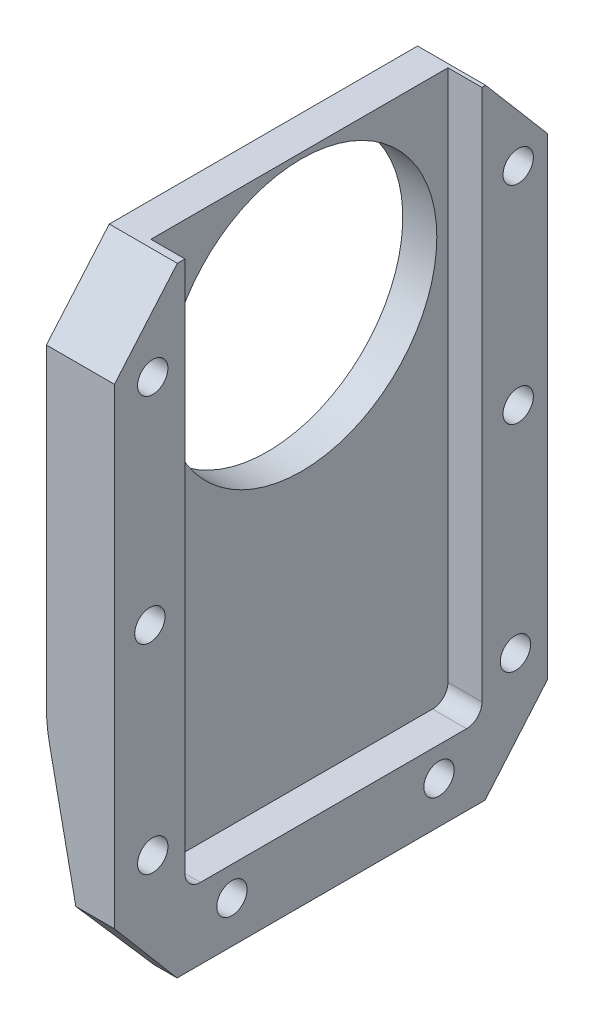
ISO-10303-21;
HEADER;
FILE_DESCRIPTION(('STEP AP214'),'2;1');
FILE_NAME('part.step','',(''),(''),'','','');
FILE_SCHEMA(('AUTOMOTIVE_DESIGN { 1 0 10303 214 1 1 1 1 }'));
ENDSEC;
DATA;
#1=APPLICATION_CONTEXT('core data for automotive mechanical design processes');
#2=APPLICATION_PROTOCOL_DEFINITION('international standard','automotive_design',2000,#1);
#3=PRODUCT_CONTEXT('',#1,'mechanical');
#4=PRODUCT('Part','Part','',(#3));
#5=PRODUCT_RELATED_PRODUCT_CATEGORY('part','',(#4));
#6=PRODUCT_DEFINITION_FORMATION('','',#4);
#7=PRODUCT_DEFINITION_CONTEXT('part definition',#1,'design');
#8=PRODUCT_DEFINITION('design','',#6,#7);
#9=PRODUCT_DEFINITION_SHAPE('','',#8);
#10=(LENGTH_UNIT() NAMED_UNIT(*) SI_UNIT(.MILLI.,.METRE.));
#11=(NAMED_UNIT(*) PLANE_ANGLE_UNIT() SI_UNIT($,.RADIAN.));
#12=(NAMED_UNIT(*) SI_UNIT($,.STERADIAN.) SOLID_ANGLE_UNIT());
#13=UNCERTAINTY_MEASURE_WITH_UNIT(LENGTH_MEASURE(1.E-05),#10,'distance_accuracy_value','');
#14=(GEOMETRIC_REPRESENTATION_CONTEXT(3) GLOBAL_UNCERTAINTY_ASSIGNED_CONTEXT((#13)) GLOBAL_UNIT_ASSIGNED_CONTEXT((#10,
#11,#12)) REPRESENTATION_CONTEXT('',''));
#15=CARTESIAN_POINT('',(0.,0.,0.));
#16=DIRECTION('',(0.,0.,1.));
#17=DIRECTION('',(1.,0.,0.));
#18=AXIS2_PLACEMENT_3D('',#15,#16,#17);
#19=CARTESIAN_POINT('',(-5.588,39.2294571648226,17.41551988832));
#20=DIRECTION('',(-1.,0.,0.));
#21=DIRECTION('',(0.,0.,1.));
#22=AXIS2_PLACEMENT_3D('',#19,#20,#21);
#23=CYLINDRICAL_SURFACE('',#22,11.1125);
#24=CARTESIAN_POINT('',(-5.588,39.2294571648226,17.41551988832));
#25=DIRECTION('',(-1.,0.,0.));
#26=DIRECTION('',(0.,0.,1.));
#27=AXIS2_PLACEMENT_3D('',#24,#25,#26);
#28=CIRCLE('',#27,11.1125);
#29=CARTESIAN_POINT('',(-5.588,39.2294571648226,28.52801988832));
#30=VERTEX_POINT('',#29);
#31=EDGE_CURVE('E177',#30,#30,#28,.T.);
#32=ORIENTED_EDGE('',*,*,#31,.T.);
#33=EDGE_LOOP('',(#32));
#34=FACE_BOUND('',#33,.T.);
#35=CARTESIAN_POINT('',(-2.794,39.2294571648226,17.41551988832));
#36=DIRECTION('',(1.,0.,0.));
#37=DIRECTION('',(0.,0.,-1.));
#38=AXIS2_PLACEMENT_3D('',#35,#36,#37);
#39=CIRCLE('',#38,11.1125);
#40=CARTESIAN_POINT('',(-2.794,39.2294571648226,6.30301988832003));
#41=VERTEX_POINT('',#40);
#42=EDGE_CURVE('E201',#41,#41,#39,.F.);
#43=ORIENTED_EDGE('',*,*,#42,.F.);
#44=EDGE_LOOP('',(#43));
#45=FACE_BOUND('',#44,.T.);
#46=ADVANCED_FACE('F37',(#34,#45),#23,.F.);
#47=CARTESIAN_POINT('',(-1.91664376205864,0.,35.56));
#48=DIRECTION('',(0.,1.,0.));
#49=DIRECTION('',(0.,0.,1.));
#50=AXIS2_PLACEMENT_3D('',#47,#48,#49);
#51=PLANE('',#50);
#52=DIRECTION('',(0.,0.,-1.));
#53=VECTOR('',#52,1.);
#54=CARTESIAN_POINT('',(-1.91664376205864,0.,35.56));
#55=LINE('',#54,#53);
#56=CARTESIAN_POINT('',(-1.91664376205864,0.,30.4170918583045));
#57=VERTEX_POINT('',#56);
#58=CARTESIAN_POINT('',(-1.91664376205864,0.,5.12869281639009));
#59=VERTEX_POINT('',#58);
#60=EDGE_CURVE('E181',#57,#59,#55,.T.);
#61=ORIENTED_EDGE('',*,*,#60,.T.);
#62=DIRECTION('',(1.,0.,0.));
#63=VECTOR('',#62,1.);
#64=CARTESIAN_POINT('',(-5.588,0.,5.12869281639009));
#65=LINE('',#64,#63);
#66=CARTESIAN_POINT('',(0.,0.,5.12869281639009));
#67=VERTEX_POINT('',#66);
#68=EDGE_CURVE('E343',#59,#67,#65,.T.);
#69=ORIENTED_EDGE('',*,*,#68,.T.);
#70=DIRECTION('',(0.,0.,-1.));
#71=VECTOR('',#70,1.);
#72=CARTESIAN_POINT('',(0.,0.,35.56));
#73=LINE('',#72,#71);
#74=CARTESIAN_POINT('',(0.,0.,30.4170918583045));
#75=VERTEX_POINT('',#74);
#76=EDGE_CURVE('E189',#75,#67,#73,.T.);
#77=ORIENTED_EDGE('',*,*,#76,.F.);
#78=DIRECTION('',(1.,0.,0.));
#79=VECTOR('',#78,1.);
#80=CARTESIAN_POINT('',(-5.588,0.,30.4170918583045));
#81=LINE('',#80,#79);
#82=EDGE_CURVE('E344',#57,#75,#81,.T.);
#83=ORIENTED_EDGE('',*,*,#82,.F.);
#84=EDGE_LOOP('',(#61,#69,#77,#83));
#85=FACE_BOUND('',#84,.T.);
#86=ADVANCED_FACE('F392',(#85),#51,.F.);
#87=CARTESIAN_POINT('',(0.,0.,35.56));
#88=DIRECTION('',(-1.,0.,0.));
#89=DIRECTION('',(0.,0.,1.));
#90=AXIS2_PLACEMENT_3D('',#87,#88,#89);
#91=PLANE('',#90);
#92=CARTESIAN_POINT('',(0.,43.7294571648226,32.41551988832));
#93=DIRECTION('',(-1.,0.,0.));
#94=DIRECTION('',(0.,0.,1.));
#95=AXIS2_PLACEMENT_3D('',#92,#93,#94);
#96=CIRCLE('',#95,1.24459999999998);
#97=CARTESIAN_POINT('',(0.,43.7294571648226,33.66011988832));
#98=VERTEX_POINT('',#97);
#99=EDGE_CURVE('E321',#98,#98,#96,.T.);
#100=ORIENTED_EDGE('',*,*,#99,.T.);
#101=EDGE_LOOP('',(#100));
#102=FACE_BOUND('',#101,.T.);
#103=CARTESIAN_POINT('',(0.,26.2121209568681,32.6523133638927));
#104=DIRECTION('',(-1.,0.,0.));
#105=DIRECTION('',(0.,0.,1.));
#106=AXIS2_PLACEMENT_3D('',#103,#104,#105);
#107=CIRCLE('',#106,1.24459999999999);
#108=CARTESIAN_POINT('',(0.,26.2121209568681,33.8969133638927));
#109=VERTEX_POINT('',#108);
#110=EDGE_CURVE('E312',#109,#109,#107,.T.);
#111=ORIENTED_EDGE('',*,*,#110,.T.);
#112=EDGE_LOOP('',(#111));
#113=FACE_BOUND('',#112,.T.);
#114=CARTESIAN_POINT('',(0.,9.72945716482264,32.41551988832));
#115=DIRECTION('',(-1.,0.,0.));
#116=DIRECTION('',(0.,0.,1.));
#117=AXIS2_PLACEMENT_3D('',#114,#115,#116);
#118=CIRCLE('',#117,1.24459999999999);
#119=CARTESIAN_POINT('',(0.,9.72945716482264,33.66011988832));
#120=VERTEX_POINT('',#119);
#121=EDGE_CURVE('E309',#120,#120,#118,.T.);
#122=ORIENTED_EDGE('',*,*,#121,.T.);
#123=EDGE_LOOP('',(#122));
#124=FACE_BOUND('',#123,.T.);
#125=CARTESIAN_POINT('',(0.,3.42945716482264,25.91551988832));
#126=DIRECTION('',(-1.,0.,0.));
#127=DIRECTION('',(0.,0.,1.));
#128=AXIS2_PLACEMENT_3D('',#125,#126,#127);
#129=CIRCLE('',#128,1.24459999999999);
#130=CARTESIAN_POINT('',(0.,3.42945716482264,27.16011988832));
#131=VERTEX_POINT('',#130);
#132=EDGE_CURVE('E303',#131,#131,#129,.T.);
#133=ORIENTED_EDGE('',*,*,#132,.T.);
#134=EDGE_LOOP('',(#133));
#135=FACE_BOUND('',#134,.T.);
#136=CARTESIAN_POINT('',(0.,3.42945716482264,8.91551988832002));
#137=DIRECTION('',(-1.,0.,0.));
#138=DIRECTION('',(0.,0.,1.));
#139=AXIS2_PLACEMENT_3D('',#136,#137,#138);
#140=CIRCLE('',#139,1.24459999999999);
#141=CARTESIAN_POINT('',(0.,3.42945716482264,10.16011988832));
#142=VERTEX_POINT('',#141);
#143=EDGE_CURVE('E297',#142,#142,#140,.T.);
#144=ORIENTED_EDGE('',*,*,#143,.T.);
#145=EDGE_LOOP('',(#144));
#146=FACE_BOUND('',#145,.T.);
#147=CARTESIAN_POINT('',(0.,9.21568873612573,2.64278820790982));
#148=DIRECTION('',(-1.,0.,0.));
#149=DIRECTION('',(0.,0.,1.));
#150=AXIS2_PLACEMENT_3D('',#147,#148,#149);
#151=CIRCLE('',#150,1.24459999999999);
#152=CARTESIAN_POINT('',(0.,9.21568873612573,3.8873882079098));
#153=VERTEX_POINT('',#152);
#154=EDGE_CURVE('E291',#153,#153,#151,.T.);
#155=ORIENTED_EDGE('',*,*,#154,.T.);
#156=EDGE_LOOP('',(#155));
#157=FACE_BOUND('',#156,.T.);
#158=CARTESIAN_POINT('',(0.,26.7294571648226,2.41551988832002));
#159=DIRECTION('',(-1.,0.,0.));
#160=DIRECTION('',(0.,0.,1.));
#161=AXIS2_PLACEMENT_3D('',#158,#159,#160);
#162=CIRCLE('',#161,1.24459999999999);
#163=CARTESIAN_POINT('',(0.,26.7294571648226,3.66011988832001));
#164=VERTEX_POINT('',#163);
#165=EDGE_CURVE('E279',#164,#164,#162,.T.);
#166=ORIENTED_EDGE('',*,*,#165,.T.);
#167=EDGE_LOOP('',(#166));
#168=FACE_BOUND('',#167,.T.);
#169=CARTESIAN_POINT('',(0.,43.7294571648226,2.41551988832002));
#170=DIRECTION('',(-1.,0.,0.));
#171=DIRECTION('',(0.,0.,1.));
#172=AXIS2_PLACEMENT_3D('',#169,#170,#171);
#173=CIRCLE('',#172,1.24459999999998);
#174=CARTESIAN_POINT('',(0.,43.7294571648226,3.66011988832001));
#175=VERTEX_POINT('',#174);
#176=EDGE_CURVE('E261',#175,#175,#173,.T.);
#177=ORIENTED_EDGE('',*,*,#176,.T.);
#178=EDGE_LOOP('',(#177));
#179=FACE_BOUND('',#178,.T.);
#180=DIRECTION('',(0.,1.,0.));
#181=VECTOR('',#180,1.);
#182=CARTESIAN_POINT('',(0.,0.,0.));
#183=LINE('',#182,#181);
#184=CARTESIAN_POINT('',(0.,6.02953117205409,0.));
#185=VERTEX_POINT('',#184);
#186=CARTESIAN_POINT('',(0.,44.8248953626975,0.));
#187=VERTEX_POINT('',#186);
#188=EDGE_CURVE('E172',#185,#187,#183,.T.);
#189=ORIENTED_EDGE('',*,*,#188,.T.);
#190=DIRECTION('',(0.,-0.761517392748183,-0.648144475053216));
#191=VECTOR('',#190,1.);
#192=CARTESIAN_POINT('',(0.,44.8248953626975,0.));
#193=LINE('',#192,#191);
#194=CARTESIAN_POINT('',(0.,50.8,5.08554511743511));
#195=VERTEX_POINT('',#194);
#196=EDGE_CURVE('E59',#195,#187,#193,.T.);
#197=ORIENTED_EDGE('',*,*,#196,.F.);
#198=DIRECTION('',(0.,0.,-1.));
#199=VECTOR('',#198,1.);
#200=CARTESIAN_POINT('',(0.,50.8,35.56));
#201=LINE('',#200,#199);
#202=CARTESIAN_POINT('',(0.,50.8,5.38804272725211));
#203=VERTEX_POINT('',#202);
#204=EDGE_CURVE('E186',#203,#195,#201,.T.);
#205=ORIENTED_EDGE('',*,*,#204,.F.);
#206=DIRECTION('',(0.,1.,0.));
#207=VECTOR('',#206,1.);
#208=CARTESIAN_POINT('',(0.,50.8,5.38804272725211));
#209=LINE('',#208,#207);
#210=CARTESIAN_POINT('',(0.,7.11199999999999,5.3880427272521));
#211=VERTEX_POINT('',#210);
#212=EDGE_CURVE('E252',#211,#203,#209,.T.);
#213=ORIENTED_EDGE('',*,*,#212,.F.);
#214=CARTESIAN_POINT('',(0.,7.11199999999999,6.6580427272521));
#215=DIRECTION('',(-1.,0.,0.));
#216=DIRECTION('',(0.,0.,1.));
#217=AXIS2_PLACEMENT_3D('',#214,#215,#216);
#218=CIRCLE('',#217,1.27);
#219=CARTESIAN_POINT('',(0.,5.84199999999999,6.6580427272521));
#220=VERTEX_POINT('',#219);
#221=EDGE_CURVE('E220',#211,#220,#218,.T.);
#222=ORIENTED_EDGE('',*,*,#221,.T.);
#223=DIRECTION('',(0.,0.,-1.));
#224=VECTOR('',#223,1.);
#225=CARTESIAN_POINT('',(0.,5.84199999999999,29.7720427272521));
#226=LINE('',#225,#224);
#227=CARTESIAN_POINT('',(0.,5.84199999999999,28.5020427272521));
#228=VERTEX_POINT('',#227);
#229=EDGE_CURVE('E255',#228,#220,#226,.T.);
#230=ORIENTED_EDGE('',*,*,#229,.F.);
#231=CARTESIAN_POINT('',(0.,7.11199999999999,28.5020427272521));
#232=DIRECTION('',(-1.,0.,0.));
#233=DIRECTION('',(0.,0.,1.));
#234=AXIS2_PLACEMENT_3D('',#231,#232,#233);
#235=CIRCLE('',#234,1.27);
#236=CARTESIAN_POINT('',(0.,7.11199999999999,29.7720427272521));
#237=VERTEX_POINT('',#236);
#238=EDGE_CURVE('E218',#228,#237,#235,.T.);
#239=ORIENTED_EDGE('',*,*,#238,.T.);
#240=DIRECTION('',(0.,-1.,0.));
#241=VECTOR('',#240,1.);
#242=CARTESIAN_POINT('',(0.,50.8,29.7720427272521));
#243=LINE('',#242,#241);
#244=CARTESIAN_POINT('',(0.,50.8,29.7720427272521));
#245=VERTEX_POINT('',#244);
#246=EDGE_CURVE('E258',#245,#237,#243,.T.);
#247=ORIENTED_EDGE('',*,*,#246,.F.);
#248=CARTESIAN_POINT('',(0.,50.8,30.3975808510955));
#249=VERTEX_POINT('',#248);
#250=EDGE_CURVE('E187',#249,#245,#201,.T.);
#251=ORIENTED_EDGE('',*,*,#250,.F.);
#252=DIRECTION('',(0.,0.759083371781677,-0.650993421383473));
#253=VECTOR('',#252,1.);
#254=CARTESIAN_POINT('',(0.,44.780420684171,35.56));
#255=LINE('',#254,#253);
#256=CARTESIAN_POINT('',(0.,44.780420684171,35.56));
#257=VERTEX_POINT('',#256);
#258=EDGE_CURVE('E336',#257,#249,#255,.T.);
#259=ORIENTED_EDGE('',*,*,#258,.F.);
#260=DIRECTION('',(0.,1.,0.));
#261=VECTOR('',#260,1.);
#262=CARTESIAN_POINT('',(0.,0.,35.56));
#263=LINE('',#262,#261);
#264=CARTESIAN_POINT('',(0.,6.07121687996455,35.56));
#265=VERTEX_POINT('',#264);
#266=EDGE_CURVE('E175',#265,#257,#263,.T.);
#267=ORIENTED_EDGE('',*,*,#266,.F.);
#268=DIRECTION('',(0.,0.763031396083279,0.646361422573472));
#269=VECTOR('',#268,1.);
#270=CARTESIAN_POINT('',(0.,0.,30.4170918583045));
#271=LINE('',#270,#269);
#272=EDGE_CURVE('E51',#75,#265,#271,.T.);
#273=ORIENTED_EDGE('',*,*,#272,.F.);
#274=ORIENTED_EDGE('',*,*,#76,.T.);
#275=DIRECTION('',(0.,-0.761715388262673,0.647911774305611));
#276=VECTOR('',#275,1.);
#277=CARTESIAN_POINT('',(0.,6.02953117205409,0.));
#278=LINE('',#277,#276);
#279=EDGE_CURVE('E346',#185,#67,#278,.T.);
#280=ORIENTED_EDGE('',*,*,#279,.F.);
#281=EDGE_LOOP('',(#189,#197,#205,#213,#222,#230,#239,#247,#251,#259,#267,#273,#274,#280));
#282=FACE_BOUND('',#281,.T.);
#283=ADVANCED_FACE('F355',(#102,#113,#124,#135,#146,#157,#168,#179,#282),#91,.F.);
#284=CARTESIAN_POINT('',(0.,50.8,35.56));
#285=DIRECTION('',(0.,-1.,0.));
#286=DIRECTION('',(0.,0.,-1.));
#287=AXIS2_PLACEMENT_3D('',#284,#285,#286);
#288=PLANE('',#287);
#289=ORIENTED_EDGE('',*,*,#204,.T.);
#290=DIRECTION('',(1.,0.,0.));
#291=VECTOR('',#290,1.);
#292=CARTESIAN_POINT('',(-5.588,50.8,5.08554511743511));
#293=LINE('',#292,#291);
#294=CARTESIAN_POINT('',(-5.588,50.8,5.08554511743511));
#295=VERTEX_POINT('',#294);
#296=EDGE_CURVE('E155',#295,#195,#293,.T.);
#297=ORIENTED_EDGE('',*,*,#296,.F.);
#298=DIRECTION('',(0.,0.,-1.));
#299=VECTOR('',#298,1.);
#300=CARTESIAN_POINT('',(-5.588,50.8,35.56));
#301=LINE('',#300,#299);
#302=CARTESIAN_POINT('',(-5.588,50.8,30.3975808510955));
#303=VERTEX_POINT('',#302);
#304=EDGE_CURVE('E165',#303,#295,#301,.T.);
#305=ORIENTED_EDGE('',*,*,#304,.F.);
#306=DIRECTION('',(1.,0.,0.));
#307=VECTOR('',#306,1.);
#308=CARTESIAN_POINT('',(-5.588,50.8,30.3975808510955));
#309=LINE('',#308,#307);
#310=EDGE_CURVE('E330',#303,#249,#309,.T.);
#311=ORIENTED_EDGE('',*,*,#310,.T.);
#312=ORIENTED_EDGE('',*,*,#250,.T.);
#313=DIRECTION('',(1.,0.,0.));
#314=VECTOR('',#313,1.);
#315=CARTESIAN_POINT('',(-2.794,50.8,29.7720427272521));
#316=LINE('',#315,#314);
#317=CARTESIAN_POINT('',(-2.794,50.8,29.7720427272521));
#318=VERTEX_POINT('',#317);
#319=EDGE_CURVE('E204',#318,#245,#316,.T.);
#320=ORIENTED_EDGE('',*,*,#319,.F.);
#321=DIRECTION('',(0.,0.,1.));
#322=VECTOR('',#321,1.);
#323=CARTESIAN_POINT('',(-2.794,50.8,29.7720427272521));
#324=LINE('',#323,#322);
#325=CARTESIAN_POINT('',(-2.794,50.8,5.3880427272521));
#326=VERTEX_POINT('',#325);
#327=EDGE_CURVE('E249',#326,#318,#324,.T.);
#328=ORIENTED_EDGE('',*,*,#327,.F.);
#329=DIRECTION('',(1.,0.,0.));
#330=VECTOR('',#329,1.);
#331=CARTESIAN_POINT('',(-2.794,50.8,5.38804272725211));
#332=LINE('',#331,#330);
#333=EDGE_CURVE('E246',#326,#203,#332,.T.);
#334=ORIENTED_EDGE('',*,*,#333,.T.);
#335=EDGE_LOOP('',(#289,#297,#305,#311,#312,#320,#328,#334));
#336=FACE_BOUND('',#335,.T.);
#337=ADVANCED_FACE('F357',(#336),#288,.F.);
#338=CARTESIAN_POINT('',(-5.588,50.8,35.56));
#339=DIRECTION('',(1.,0.,0.));
#340=DIRECTION('',(0.,0.,-1.));
#341=AXIS2_PLACEMENT_3D('',#338,#339,#340);
#342=PLANE('',#341);
#343=CARTESIAN_POINT('',(-5.588,43.7294571648226,32.41551988832));
#344=DIRECTION('',(-1.,0.,0.));
#345=DIRECTION('',(0.,0.,1.));
#346=AXIS2_PLACEMENT_3D('',#343,#344,#345);
#347=CIRCLE('',#346,1.8796);
#348=CARTESIAN_POINT('',(-5.588,43.7294571648226,34.29511988832));
#349=VERTEX_POINT('',#348);
#350=EDGE_CURVE('E327',#349,#349,#347,.T.);
#351=ORIENTED_EDGE('',*,*,#350,.F.);
#352=EDGE_LOOP('',(#351));
#353=FACE_BOUND('',#352,.T.);
#354=CARTESIAN_POINT('',(-5.588,26.2121209568681,32.6523133638927));
#355=DIRECTION('',(-1.,0.,0.));
#356=DIRECTION('',(0.,0.,1.));
#357=AXIS2_PLACEMENT_3D('',#354,#355,#356);
#358=CIRCLE('',#357,1.8796);
#359=CARTESIAN_POINT('',(-5.588,26.2121209568681,34.5319133638927));
#360=VERTEX_POINT('',#359);
#361=EDGE_CURVE('E318',#360,#360,#358,.T.);
#362=ORIENTED_EDGE('',*,*,#361,.F.);
#363=EDGE_LOOP('',(#362));
#364=FACE_BOUND('',#363,.T.);
#365=CARTESIAN_POINT('',(-5.588,26.7294571648226,2.41551988832002));
#366=DIRECTION('',(-1.,0.,0.));
#367=DIRECTION('',(0.,0.,1.));
#368=AXIS2_PLACEMENT_3D('',#365,#366,#367);
#369=CIRCLE('',#368,1.8796);
#370=CARTESIAN_POINT('',(-5.588,26.7294571648226,4.29511988832002));
#371=VERTEX_POINT('',#370);
#372=EDGE_CURVE('E285',#371,#371,#369,.T.);
#373=ORIENTED_EDGE('',*,*,#372,.F.);
#374=EDGE_LOOP('',(#373));
#375=FACE_BOUND('',#374,.T.);
#376=CARTESIAN_POINT('',(-5.588,43.7294571648226,2.41551988832002));
#377=DIRECTION('',(-1.,0.,0.));
#378=DIRECTION('',(0.,0.,1.));
#379=AXIS2_PLACEMENT_3D('',#376,#377,#378);
#380=CIRCLE('',#379,1.8796);
#381=CARTESIAN_POINT('',(-5.588,43.7294571648226,4.29511988832003));
#382=VERTEX_POINT('',#381);
#383=EDGE_CURVE('E276',#382,#382,#380,.T.);
#384=ORIENTED_EDGE('',*,*,#383,.F.);
#385=EDGE_LOOP('',(#384));
#386=FACE_BOUND('',#385,.T.);
#387=ORIENTED_EDGE('',*,*,#31,.F.);
#388=EDGE_LOOP('',(#387));
#389=FACE_BOUND('',#388,.T.);
#390=ORIENTED_EDGE('',*,*,#304,.T.);
#391=DIRECTION('',(0.,-0.761517392748183,-0.648144475053216));
#392=VECTOR('',#391,1.);
#393=CARTESIAN_POINT('',(-5.588,44.8248953626975,0.));
#394=LINE('',#393,#392);
#395=CARTESIAN_POINT('',(-5.588,44.8248953626975,0.));
#396=VERTEX_POINT('',#395);
#397=EDGE_CURVE('E149',#295,#396,#394,.T.);
#398=ORIENTED_EDGE('',*,*,#397,.T.);
#399=DIRECTION('',(0.,-1.,0.));
#400=VECTOR('',#399,1.);
#401=CARTESIAN_POINT('',(-5.588,50.8,0.));
#402=LINE('',#401,#400);
#403=CARTESIAN_POINT('',(-5.588,19.0775124180395,0.));
#404=VERTEX_POINT('',#403);
#405=EDGE_CURVE('E161',#396,#404,#402,.T.);
#406=ORIENTED_EDGE('',*,*,#405,.T.);
#407=DIRECTION('',(0.,0.,-1.));
#408=VECTOR('',#407,1.);
#409=CARTESIAN_POINT('',(-5.588,19.0775124180395,35.56));
#410=LINE('',#409,#408);
#411=CARTESIAN_POINT('',(-5.588,19.0775124180395,35.56));
#412=VERTEX_POINT('',#411);
#413=EDGE_CURVE('E196',#404,#412,#410,.F.);
#414=ORIENTED_EDGE('',*,*,#413,.T.);
#415=DIRECTION('',(0.,-1.,0.));
#416=VECTOR('',#415,1.);
#417=CARTESIAN_POINT('',(-5.588,50.8,35.56));
#418=LINE('',#417,#416);
#419=CARTESIAN_POINT('',(-5.588,44.780420684171,35.56));
#420=VERTEX_POINT('',#419);
#421=EDGE_CURVE('E237',#420,#412,#418,.T.);
#422=ORIENTED_EDGE('',*,*,#421,.F.);
#423=DIRECTION('',(0.,0.759083371781677,-0.650993421383473));
#424=VECTOR('',#423,1.);
#425=CARTESIAN_POINT('',(-5.588,44.780420684171,35.56));
#426=LINE('',#425,#424);
#427=EDGE_CURVE('E238',#420,#303,#426,.T.);
#428=ORIENTED_EDGE('',*,*,#427,.T.);
#429=EDGE_LOOP('',(#390,#398,#406,#414,#422,#428));
#430=FACE_BOUND('',#429,.T.);
#431=ADVANCED_FACE('F159',(#353,#364,#375,#386,#389,#430),#342,.F.);
#432=CARTESIAN_POINT('',(-5.588,17.78,35.56));
#433=DIRECTION('',(0.979339732195538,0.20222188047581,0.));
#434=DIRECTION('',(-0.20222188047581,0.979339732195538,0.));
#435=AXIS2_PLACEMENT_3D('',#432,#433,#434);
#436=PLANE('',#435);
#437=CARTESIAN_POINT('',(-3.9256596930966,9.72945716482264,32.41551988832));
#438=DIRECTION('',(0.979339732195538,0.20222188047581,0.));
#439=DIRECTION('',(-0.20222188047581,0.979339732195538,0.));
#440=AXIS2_PLACEMENT_3D('',#437,#438,#439);
#441=ELLIPSE('',#440,1.27085623005387,1.24459999999999);
#442=CARTESIAN_POINT('',(-4.18265462975249,10.9740571648226,32.41551988832));
#443=VERTEX_POINT('',#442);
#444=EDGE_CURVE('E306',#443,#443,#441,.T.);
#445=ORIENTED_EDGE('',*,*,#444,.T.);
#446=EDGE_LOOP('',(#445));
#447=FACE_BOUND('',#446,.T.);
#448=CARTESIAN_POINT('',(-2.62478543555832,3.42945716482264,25.91551988832));
#449=DIRECTION('',(0.979339732195538,0.20222188047581,0.));
#450=DIRECTION('',(-0.20222188047581,0.979339732195538,0.));
#451=AXIS2_PLACEMENT_3D('',#448,#449,#450);
#452=ELLIPSE('',#451,1.27085623005388,1.24459999999999);
#453=CARTESIAN_POINT('',(-2.88178037221421,4.67405716482263,25.91551988832));
#454=VERTEX_POINT('',#453);
#455=EDGE_CURVE('E300',#454,#454,#452,.T.);
#456=ORIENTED_EDGE('',*,*,#455,.T.);
#457=EDGE_LOOP('',(#456));
#458=FACE_BOUND('',#457,.T.);
#459=CARTESIAN_POINT('',(-2.62478543555832,3.42945716482264,8.91551988832002));
#460=DIRECTION('',(0.979339732195538,0.20222188047581,0.));
#461=DIRECTION('',(-0.20222188047581,0.979339732195538,0.));
#462=AXIS2_PLACEMENT_3D('',#459,#460,#461);
#463=ELLIPSE('',#462,1.27085623005388,1.24459999999999);
#464=CARTESIAN_POINT('',(-2.88178037221421,4.67405716482263,8.91551988832002));
#465=VERTEX_POINT('',#464);
#466=EDGE_CURVE('E294',#465,#465,#463,.T.);
#467=ORIENTED_EDGE('',*,*,#466,.T.);
#468=EDGE_LOOP('',(#467));
#469=FACE_BOUND('',#468,.T.);
#470=CARTESIAN_POINT('',(-3.81957268940966,9.21568873612573,2.64278820790982));
#471=DIRECTION('',(0.979339732195538,0.20222188047581,0.));
#472=DIRECTION('',(-0.20222188047581,0.979339732195538,0.));
#473=AXIS2_PLACEMENT_3D('',#470,#471,#472);
#474=ELLIPSE('',#473,1.27085623005387,1.24459999999999);
#475=CARTESIAN_POINT('',(-4.07656762606555,10.4602887361257,2.64278820790982));
#476=VERTEX_POINT('',#475);
#477=EDGE_CURVE('E288',#476,#476,#474,.T.);
#478=ORIENTED_EDGE('',*,*,#477,.T.);
#479=EDGE_LOOP('',(#478));
#480=FACE_BOUND('',#479,.T.);
#481=DIRECTION('',(0.20222188047581,-0.979339732195537,0.));
#482=VECTOR('',#481,1.);
#483=CARTESIAN_POINT('',(-5.588,17.78,0.));
#484=LINE('',#483,#482);
#485=CARTESIAN_POINT('',(-5.32561459888333,16.5092945359968,0.));
#486=VERTEX_POINT('',#485);
#487=CARTESIAN_POINT('',(-3.16166945836813,6.02953117205409,0.));
#488=VERTEX_POINT('',#487);
#489=EDGE_CURVE('E171',#486,#488,#484,.T.);
#490=ORIENTED_EDGE('',*,*,#489,.T.);
#491=DIRECTION('',(0.155374932595926,-0.752464790260893,0.640043256146366));
#492=VECTOR('',#491,1.);
#493=CARTESIAN_POINT('',(-1.05771680292443,-4.15969476772149,8.666910973793));
#494=LINE('',#493,#492);
#495=EDGE_CURVE('E228',#488,#59,#494,.T.);
#496=ORIENTED_EDGE('',*,*,#495,.T.);
#497=ORIENTED_EDGE('',*,*,#60,.F.);
#498=DIRECTION('',(-0.155636875365988,0.753733352108303,0.638485079658008));
#499=VECTOR('',#498,1.);
#500=CARTESIAN_POINT('',(-4.60238333527081,13.0067600409402,41.4350761329861));
#501=LINE('',#500,#499);
#502=CARTESIAN_POINT('',(-3.1702770558805,6.07121687996455,35.56));
#503=VERTEX_POINT('',#502);
#504=EDGE_CURVE('E338',#57,#503,#501,.T.);
#505=ORIENTED_EDGE('',*,*,#504,.T.);
#506=DIRECTION('',(0.20222188047581,-0.979339732195537,0.));
#507=VECTOR('',#506,1.);
#508=CARTESIAN_POINT('',(-5.588,17.78,35.56));
#509=LINE('',#508,#507);
#510=CARTESIAN_POINT('',(-5.32561459888333,16.5092945359968,35.56));
#511=VERTEX_POINT('',#510);
#512=EDGE_CURVE('E184',#511,#503,#509,.T.);
#513=ORIENTED_EDGE('',*,*,#512,.F.);
#514=DIRECTION('',(0.,0.,-1.));
#515=VECTOR('',#514,1.);
#516=CARTESIAN_POINT('',(-5.32561459888333,16.5092945359968,35.56));
#517=LINE('',#516,#515);
#518=EDGE_CURVE('E192',#511,#486,#517,.T.);
#519=ORIENTED_EDGE('',*,*,#518,.T.);
#520=EDGE_LOOP('',(#490,#496,#497,#505,#513,#519));
#521=FACE_BOUND('',#520,.T.);
#522=ADVANCED_FACE('F226',(#447,#458,#469,#480,#521),#436,.F.);
#523=CARTESIAN_POINT('',(0.,0.,35.56));
#524=DIRECTION('',(0.,0.,1.));
#525=DIRECTION('',(1.,0.,0.));
#526=AXIS2_PLACEMENT_3D('',#523,#524,#525);
#527=PLANE('',#526);
#528=DIRECTION('',(-1.,0.,0.));
#529=VECTOR('',#528,1.);
#530=CARTESIAN_POINT('',(0.,6.07121687996455,35.56));
#531=LINE('',#530,#529);
#532=EDGE_CURVE('E11',#265,#503,#531,.T.);
#533=ORIENTED_EDGE('',*,*,#532,.F.);
#534=ORIENTED_EDGE('',*,*,#266,.T.);
#535=DIRECTION('',(1.,0.,0.));
#536=VECTOR('',#535,1.);
#537=CARTESIAN_POINT('',(-5.588,44.780420684171,35.56));
#538=LINE('',#537,#536);
#539=EDGE_CURVE('E331',#420,#257,#538,.T.);
#540=ORIENTED_EDGE('',*,*,#539,.F.);
#541=ORIENTED_EDGE('',*,*,#421,.T.);
#542=CARTESIAN_POINT('',(7.112,19.0775124180395,35.56));
#543=DIRECTION('',(0.,0.,1.));
#544=DIRECTION('',(1.,0.,0.));
#545=AXIS2_PLACEMENT_3D('',#542,#543,#544);
#546=CIRCLE('',#545,12.7);
#547=EDGE_CURVE('E198',#412,#511,#546,.T.);
#548=ORIENTED_EDGE('',*,*,#547,.T.);
#549=ORIENTED_EDGE('',*,*,#512,.T.);
#550=EDGE_LOOP('',(#533,#534,#540,#541,#548,#549));
#551=FACE_BOUND('',#550,.T.);
#552=ADVANCED_FACE('F388',(#551),#527,.T.);
#553=CARTESIAN_POINT('',(0.,0.,0.));
#554=DIRECTION('',(0.,0.,1.));
#555=DIRECTION('',(1.,0.,0.));
#556=AXIS2_PLACEMENT_3D('',#553,#554,#555);
#557=PLANE('',#556);
#558=ORIENTED_EDGE('',*,*,#405,.F.);
#559=DIRECTION('',(1.,0.,0.));
#560=VECTOR('',#559,1.);
#561=CARTESIAN_POINT('',(-5.588,44.8248953626975,0.));
#562=LINE('',#561,#560);
#563=EDGE_CURVE('E146',#396,#187,#562,.T.);
#564=ORIENTED_EDGE('',*,*,#563,.T.);
#565=ORIENTED_EDGE('',*,*,#188,.F.);
#566=DIRECTION('',(-1.,0.,0.));
#567=VECTOR('',#566,1.);
#568=CARTESIAN_POINT('',(0.,6.02953117205409,0.));
#569=LINE('',#568,#567);
#570=EDGE_CURVE('E45',#185,#488,#569,.T.);
#571=ORIENTED_EDGE('',*,*,#570,.T.);
#572=ORIENTED_EDGE('',*,*,#489,.F.);
#573=CARTESIAN_POINT('',(7.112,19.0775124180395,0.));
#574=DIRECTION('',(0.,0.,1.));
#575=DIRECTION('',(1.,0.,0.));
#576=AXIS2_PLACEMENT_3D('',#573,#574,#575);
#577=CIRCLE('',#576,12.7);
#578=EDGE_CURVE('E169',#486,#404,#577,.F.);
#579=ORIENTED_EDGE('',*,*,#578,.T.);
#580=EDGE_LOOP('',(#558,#564,#565,#571,#572,#579));
#581=FACE_BOUND('',#580,.T.);
#582=ADVANCED_FACE('F167',(#581),#557,.F.);
#583=CARTESIAN_POINT('',(7.112,19.0775124180395,35.56));
#584=DIRECTION('',(0.,0.,-1.));
#585=DIRECTION('',(-1.,0.,0.));
#586=AXIS2_PLACEMENT_3D('',#583,#584,#585);
#587=CYLINDRICAL_SURFACE('',#586,12.7);
#588=ORIENTED_EDGE('',*,*,#547,.F.);
#589=ORIENTED_EDGE('',*,*,#413,.F.);
#590=ORIENTED_EDGE('',*,*,#578,.F.);
#591=ORIENTED_EDGE('',*,*,#518,.F.);
#592=EDGE_LOOP('',(#588,#589,#590,#591));
#593=FACE_BOUND('',#592,.T.);
#594=ADVANCED_FACE('F235',(#593),#587,.T.);
#595=CARTESIAN_POINT('',(-2.794,0.,0.));
#596=DIRECTION('',(1.,0.,0.));
#597=DIRECTION('',(0.,0.,-1.));
#598=AXIS2_PLACEMENT_3D('',#595,#596,#597);
#599=PLANE('',#598);
#600=DIRECTION('',(0.,-1.,0.));
#601=VECTOR('',#600,1.);
#602=CARTESIAN_POINT('',(-2.794,50.8,29.7720427272521));
#603=LINE('',#602,#601);
#604=CARTESIAN_POINT('',(-2.794,7.11199999999999,29.7720427272521));
#605=VERTEX_POINT('',#604);
#606=EDGE_CURVE('E254',#318,#605,#603,.T.);
#607=ORIENTED_EDGE('',*,*,#606,.T.);
#608=CARTESIAN_POINT('',(-2.794,7.11199999999999,28.5020427272521));
#609=DIRECTION('',(1.,0.,0.));
#610=DIRECTION('',(0.,0.,-1.));
#611=AXIS2_PLACEMENT_3D('',#608,#609,#610);
#612=CIRCLE('',#611,1.27);
#613=CARTESIAN_POINT('',(-2.794,5.84199999999999,28.5020427272521));
#614=VERTEX_POINT('',#613);
#615=EDGE_CURVE('E213',#605,#614,#612,.T.);
#616=ORIENTED_EDGE('',*,*,#615,.T.);
#617=DIRECTION('',(0.,0.,-1.));
#618=VECTOR('',#617,1.);
#619=CARTESIAN_POINT('',(-2.794,5.84199999999999,29.7720427272521));
#620=LINE('',#619,#618);
#621=CARTESIAN_POINT('',(-2.794,5.84199999999999,6.6580427272521));
#622=VERTEX_POINT('',#621);
#623=EDGE_CURVE('E266',#614,#622,#620,.T.);
#624=ORIENTED_EDGE('',*,*,#623,.T.);
#625=CARTESIAN_POINT('',(-2.794,7.11199999999999,6.6580427272521));
#626=DIRECTION('',(1.,0.,0.));
#627=DIRECTION('',(0.,0.,-1.));
#628=AXIS2_PLACEMENT_3D('',#625,#626,#627);
#629=CIRCLE('',#628,1.27);
#630=CARTESIAN_POINT('',(-2.794,7.11199999999999,5.3880427272521));
#631=VERTEX_POINT('',#630);
#632=EDGE_CURVE('E211',#622,#631,#629,.T.);
#633=ORIENTED_EDGE('',*,*,#632,.T.);
#634=DIRECTION('',(0.,1.,0.));
#635=VECTOR('',#634,1.);
#636=CARTESIAN_POINT('',(-2.794,50.8,5.38804272725211));
#637=LINE('',#636,#635);
#638=EDGE_CURVE('E264',#631,#326,#637,.T.);
#639=ORIENTED_EDGE('',*,*,#638,.T.);
#640=ORIENTED_EDGE('',*,*,#327,.T.);
#641=EDGE_LOOP('',(#607,#616,#624,#633,#639,#640));
#642=FACE_BOUND('',#641,.T.);
#643=ORIENTED_EDGE('',*,*,#42,.T.);
#644=EDGE_LOOP('',(#643));
#645=FACE_BOUND('',#644,.T.);
#646=ADVANCED_FACE('F374',(#642,#645),#599,.T.);
#647=CARTESIAN_POINT('',(-2.794,50.8,29.7720427272521));
#648=DIRECTION('',(0.,0.,1.));
#649=DIRECTION('',(0.,-1.,0.));
#650=AXIS2_PLACEMENT_3D('',#647,#648,#649);
#651=PLANE('',#650);
#652=ORIENTED_EDGE('',*,*,#246,.T.);
#653=DIRECTION('',(1.,0.,0.));
#654=VECTOR('',#653,1.);
#655=CARTESIAN_POINT('',(-2.794,7.11199999999999,29.7720427272521));
#656=LINE('',#655,#654);
#657=EDGE_CURVE('E209',#237,#605,#656,.F.);
#658=ORIENTED_EDGE('',*,*,#657,.T.);
#659=ORIENTED_EDGE('',*,*,#606,.F.);
#660=ORIENTED_EDGE('',*,*,#319,.T.);
#661=EDGE_LOOP('',(#652,#658,#659,#660));
#662=FACE_BOUND('',#661,.T.);
#663=ADVANCED_FACE('F383',(#662),#651,.F.);
#664=CARTESIAN_POINT('',(-2.794,50.8,5.38804272725211));
#665=DIRECTION('',(0.,0.,-1.));
#666=DIRECTION('',(0.,1.,0.));
#667=AXIS2_PLACEMENT_3D('',#664,#665,#666);
#668=PLANE('',#667);
#669=ORIENTED_EDGE('',*,*,#638,.F.);
#670=DIRECTION('',(1.,0.,0.));
#671=VECTOR('',#670,1.);
#672=CARTESIAN_POINT('',(0.,7.11199999999999,5.3880427272521));
#673=LINE('',#672,#671);
#674=EDGE_CURVE('E215',#631,#211,#673,.T.);
#675=ORIENTED_EDGE('',*,*,#674,.T.);
#676=ORIENTED_EDGE('',*,*,#212,.T.);
#677=ORIENTED_EDGE('',*,*,#333,.F.);
#678=EDGE_LOOP('',(#669,#675,#676,#677));
#679=FACE_BOUND('',#678,.T.);
#680=ADVANCED_FACE('F363',(#679),#668,.F.);
#681=CARTESIAN_POINT('',(-2.794,5.84199999999999,29.7720427272521));
#682=DIRECTION('',(0.,-1.,0.));
#683=DIRECTION('',(0.,0.,-1.));
#684=AXIS2_PLACEMENT_3D('',#681,#682,#683);
#685=PLANE('',#684);
#686=ORIENTED_EDGE('',*,*,#623,.F.);
#687=DIRECTION('',(1.,0.,0.));
#688=VECTOR('',#687,1.);
#689=CARTESIAN_POINT('',(0.,5.84199999999999,28.5020427272521));
#690=LINE('',#689,#688);
#691=EDGE_CURVE('E206',#614,#228,#690,.T.);
#692=ORIENTED_EDGE('',*,*,#691,.T.);
#693=ORIENTED_EDGE('',*,*,#229,.T.);
#694=DIRECTION('',(1.,0.,0.));
#695=VECTOR('',#694,1.);
#696=CARTESIAN_POINT('',(-2.794,5.84199999999999,6.6580427272521));
#697=LINE('',#696,#695);
#698=EDGE_CURVE('E200',#220,#622,#697,.F.);
#699=ORIENTED_EDGE('',*,*,#698,.T.);
#700=EDGE_LOOP('',(#686,#692,#693,#699));
#701=FACE_BOUND('',#700,.T.);
#702=ADVANCED_FACE('F370',(#701),#685,.F.);
#703=CARTESIAN_POINT('',(-2.794,7.11199999999999,28.5020427272521));
#704=DIRECTION('',(-1.,0.,0.));
#705=DIRECTION('',(0.,0.,1.));
#706=AXIS2_PLACEMENT_3D('',#703,#704,#705);
#707=CYLINDRICAL_SURFACE('',#706,1.27);
#708=ORIENTED_EDGE('',*,*,#615,.F.);
#709=ORIENTED_EDGE('',*,*,#657,.F.);
#710=ORIENTED_EDGE('',*,*,#238,.F.);
#711=ORIENTED_EDGE('',*,*,#691,.F.);
#712=EDGE_LOOP('',(#708,#709,#710,#711));
#713=FACE_BOUND('',#712,.T.);
#714=ADVANCED_FACE('F378',(#713),#707,.F.);
#715=CARTESIAN_POINT('',(-2.794,7.11199999999999,6.6580427272521));
#716=DIRECTION('',(-1.,0.,0.));
#717=DIRECTION('',(0.,0.,1.));
#718=AXIS2_PLACEMENT_3D('',#715,#716,#717);
#719=CYLINDRICAL_SURFACE('',#718,1.27);
#720=ORIENTED_EDGE('',*,*,#632,.F.);
#721=ORIENTED_EDGE('',*,*,#698,.F.);
#722=ORIENTED_EDGE('',*,*,#221,.F.);
#723=ORIENTED_EDGE('',*,*,#674,.F.);
#724=EDGE_LOOP('',(#720,#721,#722,#723));
#725=FACE_BOUND('',#724,.T.);
#726=ADVANCED_FACE('F39',(#725),#719,.F.);
#727=CARTESIAN_POINT('',(-5.588,43.7294571648226,2.41551988832002));
#728=DIRECTION('',(-1.,0.,0.));
#729=DIRECTION('',(0.,0.,1.));
#730=AXIS2_PLACEMENT_3D('',#727,#728,#729);
#731=CYLINDRICAL_SURFACE('',#730,1.24459999999999);
#732=ORIENTED_EDGE('',*,*,#176,.F.);
#733=EDGE_LOOP('',(#732));
#734=FACE_BOUND('',#733,.T.);
#735=CARTESIAN_POINT('',(-4.953,43.7294571648226,2.41551988832002));
#736=DIRECTION('',(-1.,0.,0.));
#737=DIRECTION('',(0.,0.,1.));
#738=AXIS2_PLACEMENT_3D('',#735,#736,#737);
#739=CIRCLE('',#738,1.2446);
#740=CARTESIAN_POINT('',(-4.953,43.7294571648226,3.66011988832002));
#741=VERTEX_POINT('',#740);
#742=EDGE_CURVE('E273',#741,#741,#739,.T.);
#743=ORIENTED_EDGE('',*,*,#742,.T.);
#744=EDGE_LOOP('',(#743));
#745=FACE_BOUND('',#744,.T.);
#746=ADVANCED_FACE('F438',(#734,#745),#731,.F.);
#747=CARTESIAN_POINT('',(-5.588,43.7294571648226,2.41551988832002));
#748=DIRECTION('',(-1.,0.,0.));
#749=DIRECTION('',(0.,0.,1.));
#750=AXIS2_PLACEMENT_3D('',#747,#748,#749);
#751=CONICAL_SURFACE('',#750,1.8796,0.78539816339745);
#752=ORIENTED_EDGE('',*,*,#742,.F.);
#753=EDGE_LOOP('',(#752));
#754=FACE_BOUND('',#753,.T.);
#755=ORIENTED_EDGE('',*,*,#383,.T.);
#756=EDGE_LOOP('',(#755));
#757=FACE_BOUND('',#756,.T.);
#758=ADVANCED_FACE('F447',(#754,#757),#751,.F.);
#759=CARTESIAN_POINT('',(-5.588,26.7294571648226,2.41551988832002));
#760=DIRECTION('',(-1.,0.,0.));
#761=DIRECTION('',(0.,0.,1.));
#762=AXIS2_PLACEMENT_3D('',#759,#760,#761);
#763=CYLINDRICAL_SURFACE('',#762,1.24459999999999);
#764=ORIENTED_EDGE('',*,*,#165,.F.);
#765=EDGE_LOOP('',(#764));
#766=FACE_BOUND('',#765,.T.);
#767=CARTESIAN_POINT('',(-4.953,26.7294571648226,2.41551988832002));
#768=DIRECTION('',(-1.,0.,0.));
#769=DIRECTION('',(0.,0.,1.));
#770=AXIS2_PLACEMENT_3D('',#767,#768,#769);
#771=CIRCLE('',#770,1.2446);
#772=CARTESIAN_POINT('',(-4.953,26.7294571648226,3.66011988832002));
#773=VERTEX_POINT('',#772);
#774=EDGE_CURVE('E282',#773,#773,#771,.T.);
#775=ORIENTED_EDGE('',*,*,#774,.T.);
#776=EDGE_LOOP('',(#775));
#777=FACE_BOUND('',#776,.T.);
#778=ADVANCED_FACE('F451',(#766,#777),#763,.F.);
#779=CARTESIAN_POINT('',(-5.588,26.7294571648226,2.41551988832002));
#780=DIRECTION('',(-1.,0.,0.));
#781=DIRECTION('',(0.,0.,1.));
#782=AXIS2_PLACEMENT_3D('',#779,#780,#781);
#783=CONICAL_SURFACE('',#782,1.8796,0.785398163397447);
#784=ORIENTED_EDGE('',*,*,#774,.F.);
#785=EDGE_LOOP('',(#784));
#786=FACE_BOUND('',#785,.T.);
#787=ORIENTED_EDGE('',*,*,#372,.T.);
#788=EDGE_LOOP('',(#787));
#789=FACE_BOUND('',#788,.T.);
#790=ADVANCED_FACE('F455',(#786,#789),#783,.F.);
#791=CARTESIAN_POINT('',(-5.588,9.21568873612573,2.64278820790982));
#792=DIRECTION('',(-1.,0.,0.));
#793=DIRECTION('',(0.,0.,1.));
#794=AXIS2_PLACEMENT_3D('',#791,#792,#793);
#795=CYLINDRICAL_SURFACE('',#794,1.24459999999999);
#796=ORIENTED_EDGE('',*,*,#154,.F.);
#797=EDGE_LOOP('',(#796));
#798=FACE_BOUND('',#797,.T.);
#799=ORIENTED_EDGE('',*,*,#477,.F.);
#800=EDGE_LOOP('',(#799));
#801=FACE_BOUND('',#800,.T.);
#802=ADVANCED_FACE('F459',(#798,#801),#795,.F.);
#803=CARTESIAN_POINT('',(-5.588,3.42945716482264,8.91551988832002));
#804=DIRECTION('',(-1.,0.,0.));
#805=DIRECTION('',(0.,0.,1.));
#806=AXIS2_PLACEMENT_3D('',#803,#804,#805);
#807=CYLINDRICAL_SURFACE('',#806,1.24459999999999);
#808=ORIENTED_EDGE('',*,*,#143,.F.);
#809=EDGE_LOOP('',(#808));
#810=FACE_BOUND('',#809,.T.);
#811=ORIENTED_EDGE('',*,*,#466,.F.);
#812=EDGE_LOOP('',(#811));
#813=FACE_BOUND('',#812,.T.);
#814=ADVANCED_FACE('F463',(#810,#813),#807,.F.);
#815=CARTESIAN_POINT('',(-5.588,3.42945716482264,25.91551988832));
#816=DIRECTION('',(-1.,0.,0.));
#817=DIRECTION('',(0.,0.,1.));
#818=AXIS2_PLACEMENT_3D('',#815,#816,#817);
#819=CYLINDRICAL_SURFACE('',#818,1.24459999999999);
#820=ORIENTED_EDGE('',*,*,#132,.F.);
#821=EDGE_LOOP('',(#820));
#822=FACE_BOUND('',#821,.T.);
#823=ORIENTED_EDGE('',*,*,#455,.F.);
#824=EDGE_LOOP('',(#823));
#825=FACE_BOUND('',#824,.T.);
#826=ADVANCED_FACE('F467',(#822,#825),#819,.F.);
#827=CARTESIAN_POINT('',(-5.588,9.72945716482264,32.41551988832));
#828=DIRECTION('',(-1.,0.,0.));
#829=DIRECTION('',(0.,0.,1.));
#830=AXIS2_PLACEMENT_3D('',#827,#828,#829);
#831=CYLINDRICAL_SURFACE('',#830,1.24459999999999);
#832=ORIENTED_EDGE('',*,*,#121,.F.);
#833=EDGE_LOOP('',(#832));
#834=FACE_BOUND('',#833,.T.);
#835=ORIENTED_EDGE('',*,*,#444,.F.);
#836=EDGE_LOOP('',(#835));
#837=FACE_BOUND('',#836,.T.);
#838=ADVANCED_FACE('F471',(#834,#837),#831,.F.);
#839=CARTESIAN_POINT('',(-5.588,26.2121209568681,32.6523133638927));
#840=DIRECTION('',(-1.,0.,0.));
#841=DIRECTION('',(0.,0.,1.));
#842=AXIS2_PLACEMENT_3D('',#839,#840,#841);
#843=CYLINDRICAL_SURFACE('',#842,1.24459999999999);
#844=ORIENTED_EDGE('',*,*,#110,.F.);
#845=EDGE_LOOP('',(#844));
#846=FACE_BOUND('',#845,.T.);
#847=CARTESIAN_POINT('',(-4.953,26.2121209568681,32.6523133638927));
#848=DIRECTION('',(-1.,0.,0.));
#849=DIRECTION('',(0.,0.,1.));
#850=AXIS2_PLACEMENT_3D('',#847,#848,#849);
#851=CIRCLE('',#850,1.2446);
#852=CARTESIAN_POINT('',(-4.953,26.2121209568681,33.8969133638927));
#853=VERTEX_POINT('',#852);
#854=EDGE_CURVE('E315',#853,#853,#851,.T.);
#855=ORIENTED_EDGE('',*,*,#854,.T.);
#856=EDGE_LOOP('',(#855));
#857=FACE_BOUND('',#856,.T.);
#858=ADVANCED_FACE('F475',(#846,#857),#843,.F.);
#859=CARTESIAN_POINT('',(-5.588,26.2121209568681,32.6523133638927));
#860=DIRECTION('',(-1.,0.,0.));
#861=DIRECTION('',(0.,0.,1.));
#862=AXIS2_PLACEMENT_3D('',#859,#860,#861);
#863=CONICAL_SURFACE('',#862,1.8796,0.785398163397447);
#864=ORIENTED_EDGE('',*,*,#854,.F.);
#865=EDGE_LOOP('',(#864));
#866=FACE_BOUND('',#865,.T.);
#867=ORIENTED_EDGE('',*,*,#361,.T.);
#868=EDGE_LOOP('',(#867));
#869=FACE_BOUND('',#868,.T.);
#870=ADVANCED_FACE('F479',(#866,#869),#863,.F.);
#871=CARTESIAN_POINT('',(-5.588,43.7294571648226,32.41551988832));
#872=DIRECTION('',(-1.,0.,0.));
#873=DIRECTION('',(0.,0.,1.));
#874=AXIS2_PLACEMENT_3D('',#871,#872,#873);
#875=CYLINDRICAL_SURFACE('',#874,1.24459999999999);
#876=ORIENTED_EDGE('',*,*,#99,.F.);
#877=EDGE_LOOP('',(#876));
#878=FACE_BOUND('',#877,.T.);
#879=CARTESIAN_POINT('',(-4.953,43.7294571648226,32.41551988832));
#880=DIRECTION('',(-1.,0.,0.));
#881=DIRECTION('',(0.,0.,1.));
#882=AXIS2_PLACEMENT_3D('',#879,#880,#881);
#883=CIRCLE('',#882,1.2446);
#884=CARTESIAN_POINT('',(-4.953,43.7294571648226,33.66011988832));
#885=VERTEX_POINT('',#884);
#886=EDGE_CURVE('E324',#885,#885,#883,.T.);
#887=ORIENTED_EDGE('',*,*,#886,.T.);
#888=EDGE_LOOP('',(#887));
#889=FACE_BOUND('',#888,.T.);
#890=ADVANCED_FACE('F483',(#878,#889),#875,.F.);
#891=CARTESIAN_POINT('',(-5.588,43.7294571648226,32.41551988832));
#892=DIRECTION('',(-1.,0.,0.));
#893=DIRECTION('',(0.,0.,1.));
#894=AXIS2_PLACEMENT_3D('',#891,#892,#893);
#895=CONICAL_SURFACE('',#894,1.8796,0.78539816339745);
#896=ORIENTED_EDGE('',*,*,#886,.F.);
#897=EDGE_LOOP('',(#896));
#898=FACE_BOUND('',#897,.T.);
#899=ORIENTED_EDGE('',*,*,#350,.T.);
#900=EDGE_LOOP('',(#899));
#901=FACE_BOUND('',#900,.T.);
#902=ADVANCED_FACE('F402',(#898,#901),#895,.F.);
#903=CARTESIAN_POINT('',(-5.588,44.780420684171,35.56));
#904=DIRECTION('',(0.,-0.650993421383473,-0.759083371781677));
#905=DIRECTION('',(0.,0.759083371781677,-0.650993421383473));
#906=AXIS2_PLACEMENT_3D('',#903,#904,#905);
#907=PLANE('',#906);
#908=ORIENTED_EDGE('',*,*,#258,.T.);
#909=ORIENTED_EDGE('',*,*,#310,.F.);
#910=ORIENTED_EDGE('',*,*,#427,.F.);
#911=ORIENTED_EDGE('',*,*,#539,.T.);
#912=EDGE_LOOP('',(#908,#909,#910,#911));
#913=FACE_BOUND('',#912,.T.);
#914=ADVANCED_FACE('F387',(#913),#907,.F.);
#915=CARTESIAN_POINT('',(-5.588,6.02953117205409,0.));
#916=DIRECTION('',(0.,0.647911774305611,0.761715388262673));
#917=DIRECTION('',(0.,-0.761715388262673,0.647911774305611));
#918=AXIS2_PLACEMENT_3D('',#915,#916,#917);
#919=PLANE('',#918);
#920=ORIENTED_EDGE('',*,*,#570,.F.);
#921=ORIENTED_EDGE('',*,*,#279,.T.);
#922=ORIENTED_EDGE('',*,*,#68,.F.);
#923=ORIENTED_EDGE('',*,*,#495,.F.);
#924=EDGE_LOOP('',(#920,#921,#922,#923));
#925=FACE_BOUND('',#924,.T.);
#926=ADVANCED_FACE('F394',(#925),#919,.F.);
#927=CARTESIAN_POINT('',(-5.588,44.8248953626975,0.));
#928=DIRECTION('',(0.,-0.648144475053216,0.761517392748183));
#929=DIRECTION('',(0.,-0.761517392748183,-0.648144475053216));
#930=AXIS2_PLACEMENT_3D('',#927,#928,#929);
#931=PLANE('',#930);
#932=ORIENTED_EDGE('',*,*,#196,.T.);
#933=ORIENTED_EDGE('',*,*,#563,.F.);
#934=ORIENTED_EDGE('',*,*,#397,.F.);
#935=ORIENTED_EDGE('',*,*,#296,.T.);
#936=EDGE_LOOP('',(#932,#933,#934,#935));
#937=FACE_BOUND('',#936,.T.);
#938=ADVANCED_FACE('F148',(#937),#931,.F.);
#939=CARTESIAN_POINT('',(-5.588,0.,30.4170918583045));
#940=DIRECTION('',(0.,0.646361422573472,-0.763031396083279));
#941=DIRECTION('',(0.,0.763031396083279,0.646361422573472));
#942=AXIS2_PLACEMENT_3D('',#939,#940,#941);
#943=PLANE('',#942);
#944=ORIENTED_EDGE('',*,*,#82,.T.);
#945=ORIENTED_EDGE('',*,*,#272,.T.);
#946=ORIENTED_EDGE('',*,*,#532,.T.);
#947=ORIENTED_EDGE('',*,*,#504,.F.);
#948=EDGE_LOOP('',(#944,#945,#946,#947));
#949=FACE_BOUND('',#948,.T.);
#950=ADVANCED_FACE('F389',(#949),#943,.F.);
#951=CLOSED_SHELL('',(#46,#86,#283,#337,#431,#522,#552,#582,#594,#646,#663,#680,#702,#714,#726,
#746,#758,#778,#790,#802,#814,#826,#838,#858,#870,#890,#902,#914,#926,#938,#950));
#952=MANIFOLD_SOLID_BREP('B2',#951);
#953=ADVANCED_BREP_SHAPE_REPRESENTATION('',(#18,#952),#14);
#954=SHAPE_DEFINITION_REPRESENTATION(#9,#953);
ENDSEC;
END-ISO-10303-21;
